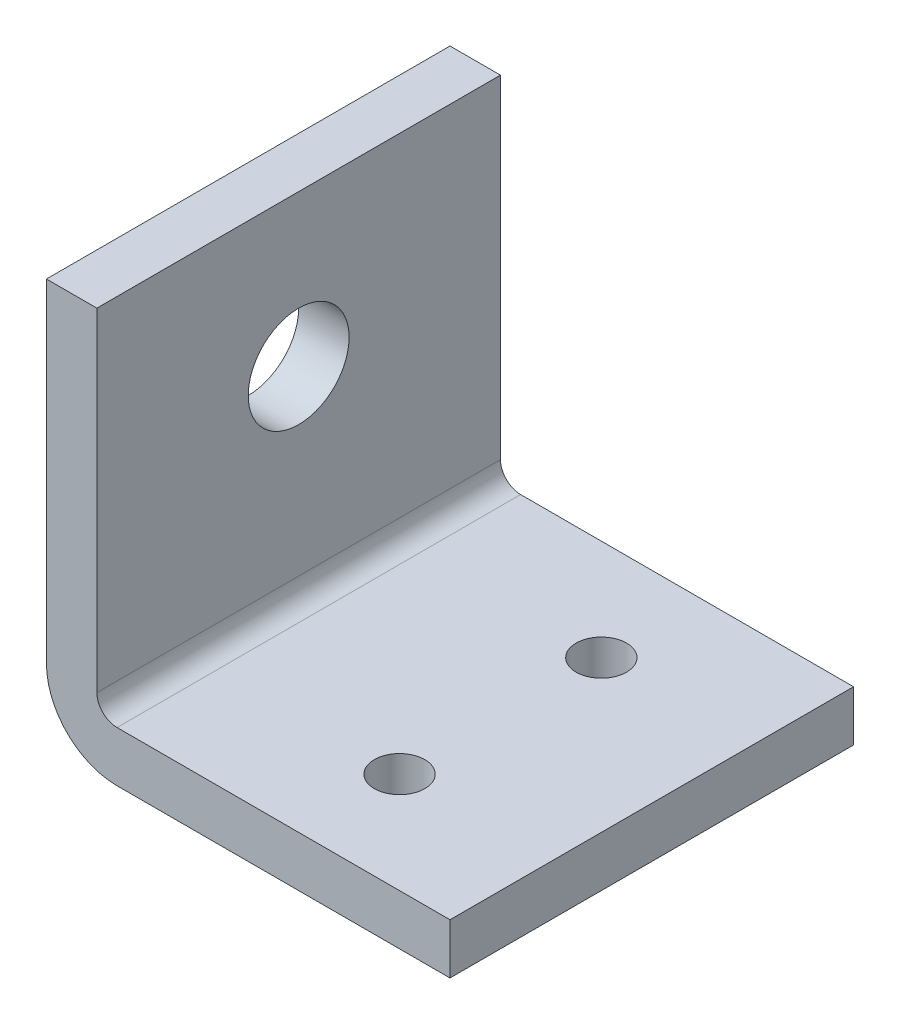
ISO-10303-21;
HEADER;
FILE_DESCRIPTION(('STEP AP214'),'2;1');
FILE_NAME('part.step','',(''),(''),'','','');
FILE_SCHEMA(('AUTOMOTIVE_DESIGN { 1 0 10303 214 1 1 1 1 }'));
ENDSEC;
DATA;
#1=APPLICATION_CONTEXT('core data for automotive mechanical design processes');
#2=APPLICATION_PROTOCOL_DEFINITION('international standard','automotive_design',2000,#1);
#3=PRODUCT_CONTEXT('',#1,'mechanical');
#4=PRODUCT('Part','Part','',(#3));
#5=PRODUCT_RELATED_PRODUCT_CATEGORY('part','',(#4));
#6=PRODUCT_DEFINITION_FORMATION('','',#4);
#7=PRODUCT_DEFINITION_CONTEXT('part definition',#1,'design');
#8=PRODUCT_DEFINITION('design','',#6,#7);
#9=PRODUCT_DEFINITION_SHAPE('','',#8);
#10=(LENGTH_UNIT() NAMED_UNIT(*) SI_UNIT(.MILLI.,.METRE.));
#11=(NAMED_UNIT(*) PLANE_ANGLE_UNIT() SI_UNIT($,.RADIAN.));
#12=(NAMED_UNIT(*) SI_UNIT($,.STERADIAN.) SOLID_ANGLE_UNIT());
#13=UNCERTAINTY_MEASURE_WITH_UNIT(LENGTH_MEASURE(1.E-05),#10,'distance_accuracy_value','');
#14=(GEOMETRIC_REPRESENTATION_CONTEXT(3) GLOBAL_UNCERTAINTY_ASSIGNED_CONTEXT((#13)) GLOBAL_UNIT_ASSIGNED_CONTEXT((#10,
#11,#12)) REPRESENTATION_CONTEXT('',''));
#15=CARTESIAN_POINT('',(0.,0.,0.));
#16=DIRECTION('',(0.,0.,1.));
#17=DIRECTION('',(1.,0.,0.));
#18=AXIS2_PLACEMENT_3D('',#15,#16,#17);
#19=CARTESIAN_POINT('',(0.,40.,20.));
#20=DIRECTION('',(0.,-1.,0.));
#21=DIRECTION('',(0.,0.,-1.));
#22=AXIS2_PLACEMENT_3D('',#19,#20,#21);
#23=PLANE('',#22);
#24=DIRECTION('',(0.,0.,1.));
#25=VECTOR('',#24,1.);
#26=CARTESIAN_POINT('',(5.,40.,-20.));
#27=LINE('',#26,#25);
#28=CARTESIAN_POINT('',(5.,40.,-20.));
#29=VERTEX_POINT('',#28);
#30=CARTESIAN_POINT('',(5.,40.,20.));
#31=VERTEX_POINT('',#30);
#32=EDGE_CURVE('E110',#29,#31,#27,.T.);
#33=ORIENTED_EDGE('',*,*,#32,.F.);
#34=DIRECTION('',(-1.,0.,0.));
#35=VECTOR('',#34,1.);
#36=CARTESIAN_POINT('',(0.,40.,-20.));
#37=LINE('',#36,#35);
#38=CARTESIAN_POINT('',(0.,40.,-20.));
#39=VERTEX_POINT('',#38);
#40=EDGE_CURVE('E118',#29,#39,#37,.T.);
#41=ORIENTED_EDGE('',*,*,#40,.T.);
#42=DIRECTION('',(0.,0.,-1.));
#43=VECTOR('',#42,1.);
#44=CARTESIAN_POINT('',(0.,40.,20.));
#45=LINE('',#44,#43);
#46=CARTESIAN_POINT('',(0.,40.,20.));
#47=VERTEX_POINT('',#46);
#48=EDGE_CURVE('E138',#47,#39,#45,.T.);
#49=ORIENTED_EDGE('',*,*,#48,.F.);
#50=DIRECTION('',(-1.,0.,0.));
#51=VECTOR('',#50,1.);
#52=CARTESIAN_POINT('',(0.,40.,20.));
#53=LINE('',#52,#51);
#54=EDGE_CURVE('E123',#31,#47,#53,.T.);
#55=ORIENTED_EDGE('',*,*,#54,.F.);
#56=EDGE_LOOP('',(#33,#41,#49,#55));
#57=FACE_BOUND('',#56,.T.);
#58=ADVANCED_FACE('F39',(#57),#23,.F.);
#59=CARTESIAN_POINT('',(0.,0.,20.));
#60=DIRECTION('',(0.,0.,-1.));
#61=DIRECTION('',(-1.,0.,0.));
#62=AXIS2_PLACEMENT_3D('',#59,#60,#61);
#63=PLANE('',#62);
#64=DIRECTION('',(0.,-1.,0.));
#65=VECTOR('',#64,1.);
#66=CARTESIAN_POINT('',(0.,0.,20.));
#67=LINE('',#66,#65);
#68=CARTESIAN_POINT('',(0.,7.,20.));
#69=VERTEX_POINT('',#68);
#70=EDGE_CURVE('E127',#47,#69,#67,.T.);
#71=ORIENTED_EDGE('',*,*,#70,.T.);
#72=CARTESIAN_POINT('',(7.,7.,20.));
#73=DIRECTION('',(0.,0.,-1.));
#74=DIRECTION('',(-1.,0.,0.));
#75=AXIS2_PLACEMENT_3D('',#72,#73,#74);
#76=CIRCLE('',#75,7.);
#77=CARTESIAN_POINT('',(7.,0.,20.));
#78=VERTEX_POINT('',#77);
#79=EDGE_CURVE('E11',#69,#78,#76,.F.);
#80=ORIENTED_EDGE('',*,*,#79,.T.);
#81=DIRECTION('',(1.,0.,0.));
#82=VECTOR('',#81,1.);
#83=CARTESIAN_POINT('',(0.,0.,20.));
#84=LINE('',#83,#82);
#85=CARTESIAN_POINT('',(40.,0.,20.));
#86=VERTEX_POINT('',#85);
#87=EDGE_CURVE('E129',#78,#86,#84,.T.);
#88=ORIENTED_EDGE('',*,*,#87,.T.);
#89=DIRECTION('',(0.,1.,0.));
#90=VECTOR('',#89,1.);
#91=CARTESIAN_POINT('',(40.,0.,20.));
#92=LINE('',#91,#90);
#93=CARTESIAN_POINT('',(40.,5.,20.));
#94=VERTEX_POINT('',#93);
#95=EDGE_CURVE('E162',#86,#94,#92,.T.);
#96=ORIENTED_EDGE('',*,*,#95,.T.);
#97=DIRECTION('',(1.,0.,0.));
#98=VECTOR('',#97,1.);
#99=CARTESIAN_POINT('',(40.,5.,20.));
#100=LINE('',#99,#98);
#101=CARTESIAN_POINT('',(7.00000000000001,5.,20.));
#102=VERTEX_POINT('',#101);
#103=EDGE_CURVE('E111',#102,#94,#100,.T.);
#104=ORIENTED_EDGE('',*,*,#103,.F.);
#105=CARTESIAN_POINT('',(7.00000000000001,7.,20.));
#106=DIRECTION('',(0.,0.,-1.));
#107=DIRECTION('',(-1.,0.,0.));
#108=AXIS2_PLACEMENT_3D('',#105,#106,#107);
#109=CIRCLE('',#108,2.);
#110=CARTESIAN_POINT('',(5.,6.99999999999999,20.));
#111=VERTEX_POINT('',#110);
#112=EDGE_CURVE('E144',#102,#111,#109,.T.);
#113=ORIENTED_EDGE('',*,*,#112,.T.);
#114=DIRECTION('',(0.,-1.,0.));
#115=VECTOR('',#114,1.);
#116=CARTESIAN_POINT('',(5.,40.,20.));
#117=LINE('',#116,#115);
#118=EDGE_CURVE('E168',#31,#111,#117,.T.);
#119=ORIENTED_EDGE('',*,*,#118,.F.);
#120=ORIENTED_EDGE('',*,*,#54,.T.);
#121=EDGE_LOOP('',(#71,#80,#88,#96,#104,#113,#119,#120));
#122=FACE_BOUND('',#121,.T.);
#123=ADVANCED_FACE('F208',(#122),#63,.F.);
#124=CARTESIAN_POINT('',(0.,0.,-20.));
#125=DIRECTION('',(0.,0.,-1.));
#126=DIRECTION('',(-1.,0.,0.));
#127=AXIS2_PLACEMENT_3D('',#124,#125,#126);
#128=PLANE('',#127);
#129=DIRECTION('',(1.,0.,0.));
#130=VECTOR('',#129,1.);
#131=CARTESIAN_POINT('',(0.,0.,-20.));
#132=LINE('',#131,#130);
#133=CARTESIAN_POINT('',(7.,0.,-20.));
#134=VERTEX_POINT('',#133);
#135=CARTESIAN_POINT('',(40.,0.,-20.));
#136=VERTEX_POINT('',#135);
#137=EDGE_CURVE('E131',#134,#136,#132,.T.);
#138=ORIENTED_EDGE('',*,*,#137,.F.);
#139=CARTESIAN_POINT('',(7.,7.,-20.));
#140=DIRECTION('',(0.,0.,-1.));
#141=DIRECTION('',(-1.,0.,0.));
#142=AXIS2_PLACEMENT_3D('',#139,#140,#141);
#143=CIRCLE('',#142,7.);
#144=CARTESIAN_POINT('',(0.,7.,-20.));
#145=VERTEX_POINT('',#144);
#146=EDGE_CURVE('E64',#134,#145,#143,.T.);
#147=ORIENTED_EDGE('',*,*,#146,.T.);
#148=DIRECTION('',(0.,-1.,0.));
#149=VECTOR('',#148,1.);
#150=CARTESIAN_POINT('',(0.,0.,-20.));
#151=LINE('',#150,#149);
#152=EDGE_CURVE('E121',#39,#145,#151,.T.);
#153=ORIENTED_EDGE('',*,*,#152,.F.);
#154=ORIENTED_EDGE('',*,*,#40,.F.);
#155=DIRECTION('',(0.,-1.,0.));
#156=VECTOR('',#155,1.);
#157=CARTESIAN_POINT('',(5.,40.,-20.));
#158=LINE('',#157,#156);
#159=CARTESIAN_POINT('',(5.,6.99999999999999,-20.));
#160=VERTEX_POINT('',#159);
#161=EDGE_CURVE('E103',#29,#160,#158,.T.);
#162=ORIENTED_EDGE('',*,*,#161,.T.);
#163=CARTESIAN_POINT('',(7.00000000000001,7.,-20.));
#164=DIRECTION('',(0.,0.,-1.));
#165=DIRECTION('',(-1.,0.,0.));
#166=AXIS2_PLACEMENT_3D('',#163,#164,#165);
#167=CIRCLE('',#166,2.);
#168=CARTESIAN_POINT('',(7.00000000000001,5.,-20.));
#169=VERTEX_POINT('',#168);
#170=EDGE_CURVE('E150',#160,#169,#167,.F.);
#171=ORIENTED_EDGE('',*,*,#170,.T.);
#172=DIRECTION('',(1.,0.,0.));
#173=VECTOR('',#172,1.);
#174=CARTESIAN_POINT('',(40.,5.,-20.));
#175=LINE('',#174,#173);
#176=CARTESIAN_POINT('',(40.,5.,-20.));
#177=VERTEX_POINT('',#176);
#178=EDGE_CURVE('E114',#169,#177,#175,.T.);
#179=ORIENTED_EDGE('',*,*,#178,.T.);
#180=DIRECTION('',(0.,1.,0.));
#181=VECTOR('',#180,1.);
#182=CARTESIAN_POINT('',(40.,0.,-20.));
#183=LINE('',#182,#181);
#184=EDGE_CURVE('E130',#136,#177,#183,.T.);
#185=ORIENTED_EDGE('',*,*,#184,.F.);
#186=EDGE_LOOP('',(#138,#147,#153,#154,#162,#171,#179,#185));
#187=FACE_BOUND('',#186,.T.);
#188=ADVANCED_FACE('F125',(#187),#128,.T.);
#189=CARTESIAN_POINT('',(0.,0.,20.));
#190=DIRECTION('',(1.,0.,0.));
#191=DIRECTION('',(0.,0.,-1.));
#192=AXIS2_PLACEMENT_3D('',#189,#190,#191);
#193=PLANE('',#192);
#194=CARTESIAN_POINT('',(0.,25.,0.));
#195=DIRECTION('',(1.,0.,0.));
#196=DIRECTION('',(0.,0.,-1.));
#197=AXIS2_PLACEMENT_3D('',#194,#195,#196);
#198=CIRCLE('',#197,5.00000000000001);
#199=CARTESIAN_POINT('',(0.,25.,-5.00000000000001));
#200=VERTEX_POINT('',#199);
#201=EDGE_CURVE('E171',#200,#200,#198,.T.);
#202=ORIENTED_EDGE('',*,*,#201,.T.);
#203=EDGE_LOOP('',(#202));
#204=FACE_BOUND('',#203,.T.);
#205=ORIENTED_EDGE('',*,*,#152,.T.);
#206=DIRECTION('',(0.,0.,-1.));
#207=VECTOR('',#206,1.);
#208=CARTESIAN_POINT('',(0.,7.,20.));
#209=LINE('',#208,#207);
#210=EDGE_CURVE('E50',#145,#69,#209,.F.);
#211=ORIENTED_EDGE('',*,*,#210,.T.);
#212=ORIENTED_EDGE('',*,*,#70,.F.);
#213=ORIENTED_EDGE('',*,*,#48,.T.);
#214=EDGE_LOOP('',(#205,#211,#212,#213));
#215=FACE_BOUND('',#214,.T.);
#216=ADVANCED_FACE('F217',(#204,#215),#193,.F.);
#217=CARTESIAN_POINT('',(0.,0.,20.));
#218=DIRECTION('',(0.,1.,0.));
#219=DIRECTION('',(0.,0.,1.));
#220=AXIS2_PLACEMENT_3D('',#217,#218,#219);
#221=PLANE('',#220);
#222=CARTESIAN_POINT('',(25.,0.,-10.));
#223=DIRECTION('',(0.,1.,0.));
#224=DIRECTION('',(0.,0.,1.));
#225=AXIS2_PLACEMENT_3D('',#222,#223,#224);
#226=CIRCLE('',#225,2.50000000000001);
#227=CARTESIAN_POINT('',(25.,0.,-7.49999999999999));
#228=VERTEX_POINT('',#227);
#229=EDGE_CURVE('E183',#228,#228,#226,.T.);
#230=ORIENTED_EDGE('',*,*,#229,.T.);
#231=EDGE_LOOP('',(#230));
#232=FACE_BOUND('',#231,.T.);
#233=CARTESIAN_POINT('',(25.,0.,10.));
#234=DIRECTION('',(0.,1.,0.));
#235=DIRECTION('',(0.,0.,1.));
#236=AXIS2_PLACEMENT_3D('',#233,#234,#235);
#237=CIRCLE('',#236,2.50000000000001);
#238=CARTESIAN_POINT('',(25.,0.,12.5));
#239=VERTEX_POINT('',#238);
#240=EDGE_CURVE('E180',#239,#239,#237,.T.);
#241=ORIENTED_EDGE('',*,*,#240,.T.);
#242=EDGE_LOOP('',(#241));
#243=FACE_BOUND('',#242,.T.);
#244=ORIENTED_EDGE('',*,*,#87,.F.);
#245=DIRECTION('',(0.,0.,-1.));
#246=VECTOR('',#245,1.);
#247=CARTESIAN_POINT('',(7.,0.,20.));
#248=LINE('',#247,#246);
#249=EDGE_CURVE('E149',#78,#134,#248,.T.);
#250=ORIENTED_EDGE('',*,*,#249,.T.);
#251=ORIENTED_EDGE('',*,*,#137,.T.);
#252=DIRECTION('',(0.,0.,-1.));
#253=VECTOR('',#252,1.);
#254=CARTESIAN_POINT('',(40.,0.,20.));
#255=LINE('',#254,#253);
#256=EDGE_CURVE('E137',#86,#136,#255,.T.);
#257=ORIENTED_EDGE('',*,*,#256,.F.);
#258=EDGE_LOOP('',(#244,#250,#251,#257));
#259=FACE_BOUND('',#258,.T.);
#260=ADVANCED_FACE('F154',(#232,#243,#259),#221,.F.);
#261=CARTESIAN_POINT('',(40.,0.,20.));
#262=DIRECTION('',(-1.,0.,0.));
#263=DIRECTION('',(0.,0.,1.));
#264=AXIS2_PLACEMENT_3D('',#261,#262,#263);
#265=PLANE('',#264);
#266=ORIENTED_EDGE('',*,*,#184,.T.);
#267=DIRECTION('',(0.,0.,1.));
#268=VECTOR('',#267,1.);
#269=CARTESIAN_POINT('',(40.,5.,-20.));
#270=LINE('',#269,#268);
#271=EDGE_CURVE('E124',#177,#94,#270,.T.);
#272=ORIENTED_EDGE('',*,*,#271,.T.);
#273=ORIENTED_EDGE('',*,*,#95,.F.);
#274=ORIENTED_EDGE('',*,*,#256,.T.);
#275=EDGE_LOOP('',(#266,#272,#273,#274));
#276=FACE_BOUND('',#275,.T.);
#277=ADVANCED_FACE('F197',(#276),#265,.F.);
#278=CARTESIAN_POINT('',(40.,5.,-20.));
#279=DIRECTION('',(0.,-1.,0.));
#280=DIRECTION('',(1.,0.,0.));
#281=AXIS2_PLACEMENT_3D('',#278,#279,#280);
#282=PLANE('',#281);
#283=CARTESIAN_POINT('',(25.,5.,-10.));
#284=DIRECTION('',(0.,1.,0.));
#285=DIRECTION('',(0.,0.,1.));
#286=AXIS2_PLACEMENT_3D('',#283,#284,#285);
#287=CIRCLE('',#286,2.50000000000001);
#288=CARTESIAN_POINT('',(25.,5.,-7.49999999999999));
#289=VERTEX_POINT('',#288);
#290=EDGE_CURVE('E190',#289,#289,#287,.T.);
#291=ORIENTED_EDGE('',*,*,#290,.F.);
#292=EDGE_LOOP('',(#291));
#293=FACE_BOUND('',#292,.T.);
#294=CARTESIAN_POINT('',(25.,5.,10.));
#295=DIRECTION('',(0.,1.,0.));
#296=DIRECTION('',(0.,0.,1.));
#297=AXIS2_PLACEMENT_3D('',#294,#295,#296);
#298=CIRCLE('',#297,2.50000000000001);
#299=CARTESIAN_POINT('',(25.,5.,12.5));
#300=VERTEX_POINT('',#299);
#301=EDGE_CURVE('E185',#300,#300,#298,.T.);
#302=ORIENTED_EDGE('',*,*,#301,.F.);
#303=EDGE_LOOP('',(#302));
#304=FACE_BOUND('',#303,.T.);
#305=ORIENTED_EDGE('',*,*,#178,.F.);
#306=DIRECTION('',(0.,0.,1.));
#307=VECTOR('',#306,1.);
#308=CARTESIAN_POINT('',(7.00000000000001,5.,20.));
#309=LINE('',#308,#307);
#310=EDGE_CURVE('E143',#169,#102,#309,.T.);
#311=ORIENTED_EDGE('',*,*,#310,.T.);
#312=ORIENTED_EDGE('',*,*,#103,.T.);
#313=ORIENTED_EDGE('',*,*,#271,.F.);
#314=EDGE_LOOP('',(#305,#311,#312,#313));
#315=FACE_BOUND('',#314,.T.);
#316=ADVANCED_FACE('F195',(#293,#304,#315),#282,.F.);
#317=CARTESIAN_POINT('',(5.,40.,-20.));
#318=DIRECTION('',(-1.,0.,0.));
#319=DIRECTION('',(0.,-1.,0.));
#320=AXIS2_PLACEMENT_3D('',#317,#318,#319);
#321=PLANE('',#320);
#322=CARTESIAN_POINT('',(5.,25.,0.));
#323=DIRECTION('',(1.,0.,0.));
#324=DIRECTION('',(0.,0.,-1.));
#325=AXIS2_PLACEMENT_3D('',#322,#323,#324);
#326=CIRCLE('',#325,5.00000000000001);
#327=CARTESIAN_POINT('',(5.,25.,-5.00000000000001));
#328=VERTEX_POINT('',#327);
#329=EDGE_CURVE('E178',#328,#328,#326,.T.);
#330=ORIENTED_EDGE('',*,*,#329,.F.);
#331=EDGE_LOOP('',(#330));
#332=FACE_BOUND('',#331,.T.);
#333=ORIENTED_EDGE('',*,*,#118,.T.);
#334=DIRECTION('',(0.,0.,1.));
#335=VECTOR('',#334,1.);
#336=CARTESIAN_POINT('',(5.,7.,-20.));
#337=LINE('',#336,#335);
#338=EDGE_CURVE('E109',#111,#160,#337,.F.);
#339=ORIENTED_EDGE('',*,*,#338,.T.);
#340=ORIENTED_EDGE('',*,*,#161,.F.);
#341=ORIENTED_EDGE('',*,*,#32,.T.);
#342=EDGE_LOOP('',(#333,#339,#340,#341));
#343=FACE_BOUND('',#342,.T.);
#344=ADVANCED_FACE('F106',(#332,#343),#321,.F.);
#345=CARTESIAN_POINT('',(7.00000000000001,7.,-20.));
#346=DIRECTION('',(0.,0.,-1.));
#347=DIRECTION('',(-1.,0.,0.));
#348=AXIS2_PLACEMENT_3D('',#345,#346,#347);
#349=CYLINDRICAL_SURFACE('',#348,2.);
#350=ORIENTED_EDGE('',*,*,#170,.F.);
#351=ORIENTED_EDGE('',*,*,#338,.F.);
#352=ORIENTED_EDGE('',*,*,#112,.F.);
#353=ORIENTED_EDGE('',*,*,#310,.F.);
#354=EDGE_LOOP('',(#350,#351,#352,#353));
#355=FACE_BOUND('',#354,.T.);
#356=ADVANCED_FACE('F206',(#355),#349,.F.);
#357=CARTESIAN_POINT('',(7.,7.,20.));
#358=DIRECTION('',(0.,0.,-1.));
#359=DIRECTION('',(-1.,0.,0.));
#360=AXIS2_PLACEMENT_3D('',#357,#358,#359);
#361=CYLINDRICAL_SURFACE('',#360,7.);
#362=ORIENTED_EDGE('',*,*,#79,.F.);
#363=ORIENTED_EDGE('',*,*,#210,.F.);
#364=ORIENTED_EDGE('',*,*,#146,.F.);
#365=ORIENTED_EDGE('',*,*,#249,.F.);
#366=EDGE_LOOP('',(#362,#363,#364,#365));
#367=FACE_BOUND('',#366,.T.);
#368=ADVANCED_FACE('F41',(#367),#361,.T.);
#369=CARTESIAN_POINT('',(5.,25.,0.));
#370=DIRECTION('',(1.,0.,0.));
#371=DIRECTION('',(0.,0.,-1.));
#372=AXIS2_PLACEMENT_3D('',#369,#370,#371);
#373=CYLINDRICAL_SURFACE('',#372,5.00000000000001);
#374=ORIENTED_EDGE('',*,*,#201,.F.);
#375=EDGE_LOOP('',(#374));
#376=FACE_BOUND('',#375,.T.);
#377=ORIENTED_EDGE('',*,*,#329,.T.);
#378=EDGE_LOOP('',(#377));
#379=FACE_BOUND('',#378,.T.);
#380=ADVANCED_FACE('F234',(#376,#379),#373,.F.);
#381=CARTESIAN_POINT('',(25.,5.,10.));
#382=DIRECTION('',(0.,1.,0.));
#383=DIRECTION('',(0.,0.,1.));
#384=AXIS2_PLACEMENT_3D('',#381,#382,#383);
#385=CYLINDRICAL_SURFACE('',#384,2.50000000000001);
#386=ORIENTED_EDGE('',*,*,#240,.F.);
#387=EDGE_LOOP('',(#386));
#388=FACE_BOUND('',#387,.T.);
#389=ORIENTED_EDGE('',*,*,#301,.T.);
#390=EDGE_LOOP('',(#389));
#391=FACE_BOUND('',#390,.T.);
#392=ADVANCED_FACE('F231',(#388,#391),#385,.F.);
#393=CARTESIAN_POINT('',(25.,5.,-10.));
#394=DIRECTION('',(0.,1.,0.));
#395=DIRECTION('',(0.,0.,1.));
#396=AXIS2_PLACEMENT_3D('',#393,#394,#395);
#397=CYLINDRICAL_SURFACE('',#396,2.50000000000001);
#398=ORIENTED_EDGE('',*,*,#229,.F.);
#399=EDGE_LOOP('',(#398));
#400=FACE_BOUND('',#399,.T.);
#401=ORIENTED_EDGE('',*,*,#290,.T.);
#402=EDGE_LOOP('',(#401));
#403=FACE_BOUND('',#402,.T.);
#404=ADVANCED_FACE('F194',(#400,#403),#397,.F.);
#405=CLOSED_SHELL('',(#58,#123,#188,#216,#260,#277,#316,#344,#356,#368,#380,#392,#404));
#406=MANIFOLD_SOLID_BREP('B2',#405);
#407=ADVANCED_BREP_SHAPE_REPRESENTATION('',(#18,#406),#14);
#408=SHAPE_DEFINITION_REPRESENTATION(#9,#407);
ENDSEC;
END-ISO-10303-21;
